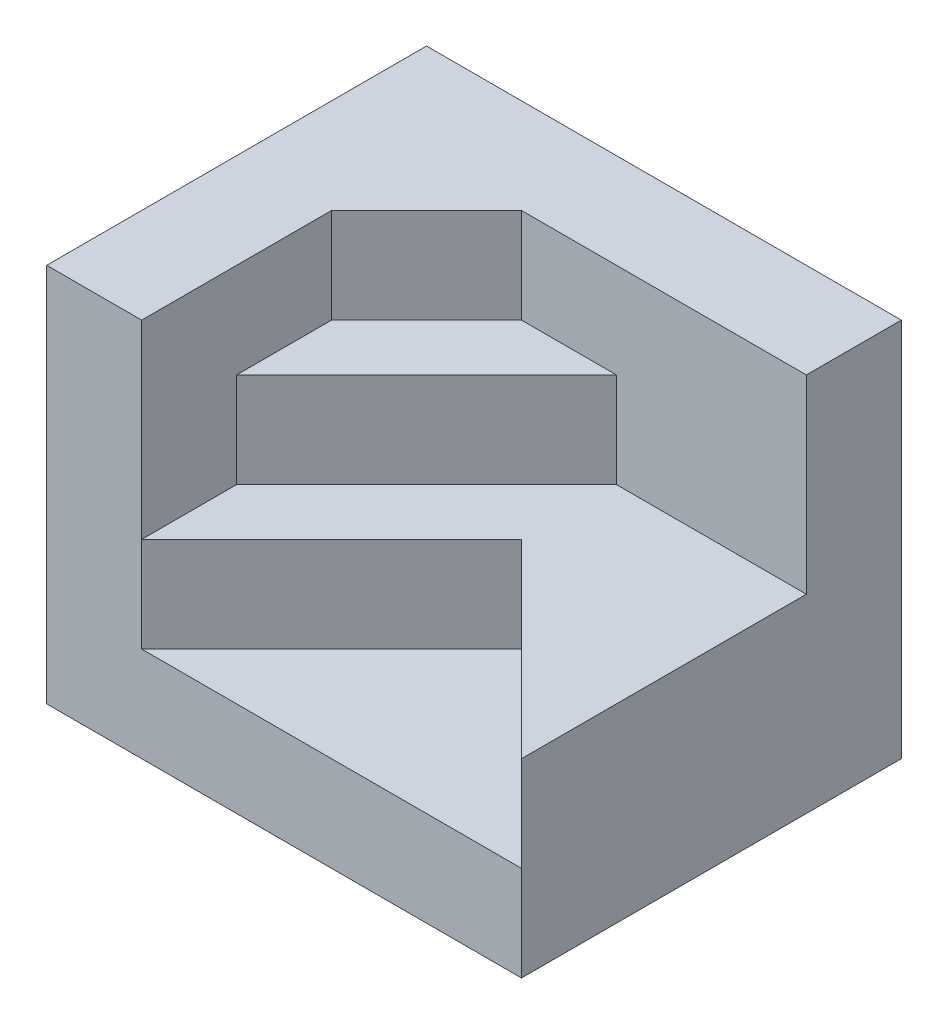
ISO-10303-21;
HEADER;
FILE_DESCRIPTION(('STEP AP214'),'2;1');
FILE_NAME('part.step','',(''),(''),'','','');
FILE_SCHEMA(('AUTOMOTIVE_DESIGN { 1 0 10303 214 1 1 1 1 }'));
ENDSEC;
DATA;
#1=APPLICATION_CONTEXT('core data for automotive mechanical design processes');
#2=APPLICATION_PROTOCOL_DEFINITION('international standard','automotive_design',2000,#1);
#3=PRODUCT_CONTEXT('',#1,'mechanical');
#4=PRODUCT('Part','Part','',(#3));
#5=PRODUCT_RELATED_PRODUCT_CATEGORY('part','',(#4));
#6=PRODUCT_DEFINITION_FORMATION('','',#4);
#7=PRODUCT_DEFINITION_CONTEXT('part definition',#1,'design');
#8=PRODUCT_DEFINITION('design','',#6,#7);
#9=PRODUCT_DEFINITION_SHAPE('','',#8);
#10=(LENGTH_UNIT() NAMED_UNIT(*) SI_UNIT(.MILLI.,.METRE.));
#11=(NAMED_UNIT(*) PLANE_ANGLE_UNIT() SI_UNIT($,.RADIAN.));
#12=(NAMED_UNIT(*) SI_UNIT($,.STERADIAN.) SOLID_ANGLE_UNIT());
#13=UNCERTAINTY_MEASURE_WITH_UNIT(LENGTH_MEASURE(1.E-05),#10,'distance_accuracy_value','');
#14=(GEOMETRIC_REPRESENTATION_CONTEXT(3) GLOBAL_UNCERTAINTY_ASSIGNED_CONTEXT((#13)) GLOBAL_UNIT_ASSIGNED_CONTEXT((#10,
#11,#12)) REPRESENTATION_CONTEXT('',''));
#15=CARTESIAN_POINT('',(0.,0.,0.));
#16=DIRECTION('',(0.,0.,1.));
#17=DIRECTION('',(1.,0.,0.));
#18=AXIS2_PLACEMENT_3D('',#15,#16,#17);
#19=CARTESIAN_POINT('',(1.,4.,0.));
#20=DIRECTION('',(-1.,0.,0.));
#21=DIRECTION('',(0.,0.,1.));
#22=AXIS2_PLACEMENT_3D('',#19,#20,#21);
#23=PLANE('',#22);
#24=DIRECTION('',(0.,-1.,0.));
#25=VECTOR('',#24,1.);
#26=CARTESIAN_POINT('',(1.,3.,-0.999999999999998));
#27=LINE('',#26,#25);
#28=CARTESIAN_POINT('',(1.,3.,-0.999999999999998));
#29=VERTEX_POINT('',#28);
#30=CARTESIAN_POINT('',(1.,2.,-0.999999999999999));
#31=VERTEX_POINT('',#30);
#32=EDGE_CURVE('E50',#29,#31,#27,.T.);
#33=ORIENTED_EDGE('',*,*,#32,.F.);
#34=DIRECTION('',(0.,0.,1.));
#35=VECTOR('',#34,1.);
#36=CARTESIAN_POINT('',(1.,3.,-0.999999999999998));
#37=LINE('',#36,#35);
#38=CARTESIAN_POINT('',(1.,3.,-2.));
#39=VERTEX_POINT('',#38);
#40=EDGE_CURVE('E131',#39,#29,#37,.T.);
#41=ORIENTED_EDGE('',*,*,#40,.F.);
#42=DIRECTION('',(0.,-1.,0.));
#43=VECTOR('',#42,1.);
#44=CARTESIAN_POINT('',(1.,4.,-2.));
#45=LINE('',#44,#43);
#46=CARTESIAN_POINT('',(1.,4.,-2.));
#47=VERTEX_POINT('',#46);
#48=EDGE_CURVE('E192',#47,#39,#45,.T.);
#49=ORIENTED_EDGE('',*,*,#48,.F.);
#50=DIRECTION('',(0.,0.,-1.));
#51=VECTOR('',#50,1.);
#52=CARTESIAN_POINT('',(1.,4.,0.));
#53=LINE('',#52,#51);
#54=CARTESIAN_POINT('',(1.,4.,0.));
#55=VERTEX_POINT('',#54);
#56=EDGE_CURVE('E174',#55,#47,#53,.T.);
#57=ORIENTED_EDGE('',*,*,#56,.F.);
#58=DIRECTION('',(0.,-1.,0.));
#59=VECTOR('',#58,1.);
#60=CARTESIAN_POINT('',(1.,4.,0.));
#61=LINE('',#60,#59);
#62=CARTESIAN_POINT('',(1.,2.,0.));
#63=VERTEX_POINT('',#62);
#64=EDGE_CURVE('E194',#55,#63,#61,.T.);
#65=ORIENTED_EDGE('',*,*,#64,.T.);
#66=DIRECTION('',(0.,0.,1.));
#67=VECTOR('',#66,1.);
#68=CARTESIAN_POINT('',(1.,2.,0.));
#69=LINE('',#68,#67);
#70=EDGE_CURVE('E144',#31,#63,#69,.T.);
#71=ORIENTED_EDGE('',*,*,#70,.F.);
#72=EDGE_LOOP('',(#33,#41,#49,#57,#65,#71));
#73=FACE_BOUND('',#72,.T.);
#74=ADVANCED_FACE('F35',(#73),#23,.F.);
#75=CARTESIAN_POINT('',(1.,4.,-2.));
#76=DIRECTION('',(-0.707106781186548,0.,-0.707106781186547));
#77=DIRECTION('',(-0.707106781186547,0.,0.707106781186548));
#78=AXIS2_PLACEMENT_3D('',#75,#76,#77);
#79=PLANE('',#78);
#80=DIRECTION('',(-0.707106781186547,0.,0.707106781186548));
#81=VECTOR('',#80,1.);
#82=CARTESIAN_POINT('',(1.,3.,-2.));
#83=LINE('',#82,#81);
#84=CARTESIAN_POINT('',(2.,3.,-3.));
#85=VERTEX_POINT('',#84);
#86=EDGE_CURVE('E136',#85,#39,#83,.T.);
#87=ORIENTED_EDGE('',*,*,#86,.F.);
#88=DIRECTION('',(0.,-1.,0.));
#89=VECTOR('',#88,1.);
#90=CARTESIAN_POINT('',(2.,4.,-3.));
#91=LINE('',#90,#89);
#92=CARTESIAN_POINT('',(2.,4.,-3.));
#93=VERTEX_POINT('',#92);
#94=EDGE_CURVE('E189',#93,#85,#91,.T.);
#95=ORIENTED_EDGE('',*,*,#94,.F.);
#96=DIRECTION('',(0.707106781186547,0.,-0.707106781186548));
#97=VECTOR('',#96,1.);
#98=CARTESIAN_POINT('',(1.,4.,-2.));
#99=LINE('',#98,#97);
#100=EDGE_CURVE('E176',#47,#93,#99,.T.);
#101=ORIENTED_EDGE('',*,*,#100,.F.);
#102=ORIENTED_EDGE('',*,*,#48,.T.);
#103=EDGE_LOOP('',(#87,#95,#101,#102));
#104=FACE_BOUND('',#103,.T.);
#105=ADVANCED_FACE('F246',(#104),#79,.F.);
#106=CARTESIAN_POINT('',(2.,4.,-3.));
#107=DIRECTION('',(0.,0.,-1.));
#108=DIRECTION('',(-1.,0.,0.));
#109=AXIS2_PLACEMENT_3D('',#106,#107,#108);
#110=PLANE('',#109);
#111=DIRECTION('',(0.,-1.,0.));
#112=VECTOR('',#111,1.);
#113=CARTESIAN_POINT('',(3.,3.,-3.));
#114=LINE('',#113,#112);
#115=CARTESIAN_POINT('',(3.,3.,-3.));
#116=VERTEX_POINT('',#115);
#117=CARTESIAN_POINT('',(3.,2.,-3.));
#118=VERTEX_POINT('',#117);
#119=EDGE_CURVE('E127',#116,#118,#114,.T.);
#120=ORIENTED_EDGE('',*,*,#119,.T.);
#121=DIRECTION('',(-1.,0.,0.));
#122=VECTOR('',#121,1.);
#123=CARTESIAN_POINT('',(2.,2.,-3.));
#124=LINE('',#123,#122);
#125=CARTESIAN_POINT('',(5.,2.,-3.));
#126=VERTEX_POINT('',#125);
#127=EDGE_CURVE('E153',#126,#118,#124,.T.);
#128=ORIENTED_EDGE('',*,*,#127,.F.);
#129=DIRECTION('',(0.,-1.,0.));
#130=VECTOR('',#129,1.);
#131=CARTESIAN_POINT('',(5.,4.,-3.));
#132=LINE('',#131,#130);
#133=CARTESIAN_POINT('',(5.,4.,-3.));
#134=VERTEX_POINT('',#133);
#135=EDGE_CURVE('E186',#134,#126,#132,.T.);
#136=ORIENTED_EDGE('',*,*,#135,.F.);
#137=DIRECTION('',(1.,0.,0.));
#138=VECTOR('',#137,1.);
#139=CARTESIAN_POINT('',(2.,4.,-3.));
#140=LINE('',#139,#138);
#141=EDGE_CURVE('E178',#93,#134,#140,.T.);
#142=ORIENTED_EDGE('',*,*,#141,.F.);
#143=ORIENTED_EDGE('',*,*,#94,.T.);
#144=DIRECTION('',(-1.,0.,0.));
#145=VECTOR('',#144,1.);
#146=CARTESIAN_POINT('',(2.,3.,-3.));
#147=LINE('',#146,#145);
#148=EDGE_CURVE('E130',#116,#85,#147,.T.);
#149=ORIENTED_EDGE('',*,*,#148,.F.);
#150=EDGE_LOOP('',(#120,#128,#136,#142,#143,#149));
#151=FACE_BOUND('',#150,.T.);
#152=ADVANCED_FACE('F239',(#151),#110,.F.);
#153=CARTESIAN_POINT('',(0.,2.,0.));
#154=DIRECTION('',(0.,1.,0.));
#155=DIRECTION('',(0.,0.,1.));
#156=AXIS2_PLACEMENT_3D('',#153,#154,#155);
#157=PLANE('',#156);
#158=ORIENTED_EDGE('',*,*,#127,.T.);
#159=DIRECTION('',(0.707106781186547,0.,-0.707106781186548));
#160=VECTOR('',#159,1.);
#161=CARTESIAN_POINT('',(3.,2.,-3.));
#162=LINE('',#161,#160);
#163=EDGE_CURVE('E140',#31,#118,#162,.T.);
#164=ORIENTED_EDGE('',*,*,#163,.F.);
#165=ORIENTED_EDGE('',*,*,#70,.T.);
#166=DIRECTION('',(0.707106781186548,0.,-0.707106781186548));
#167=VECTOR('',#166,1.);
#168=CARTESIAN_POINT('',(3.,2.,-2.));
#169=LINE('',#168,#167);
#170=CARTESIAN_POINT('',(3.,2.,-2.));
#171=VERTEX_POINT('',#170);
#172=EDGE_CURVE('E156',#63,#171,#169,.T.);
#173=ORIENTED_EDGE('',*,*,#172,.T.);
#174=DIRECTION('',(0.707106781186548,0.,0.707106781186548));
#175=VECTOR('',#174,1.);
#176=CARTESIAN_POINT('',(5.,2.,0.));
#177=LINE('',#176,#175);
#178=CARTESIAN_POINT('',(5.,2.,0.));
#179=VERTEX_POINT('',#178);
#180=EDGE_CURVE('E158',#171,#179,#177,.T.);
#181=ORIENTED_EDGE('',*,*,#180,.T.);
#182=DIRECTION('',(0.,0.,-1.));
#183=VECTOR('',#182,1.);
#184=CARTESIAN_POINT('',(5.,2.,-3.));
#185=LINE('',#184,#183);
#186=EDGE_CURVE('E58',#179,#126,#185,.T.);
#187=ORIENTED_EDGE('',*,*,#186,.T.);
#188=EDGE_LOOP('',(#158,#164,#165,#173,#181,#187));
#189=FACE_BOUND('',#188,.T.);
#190=ADVANCED_FACE('F240',(#189),#157,.T.);
#191=CARTESIAN_POINT('',(0.,1.,0.));
#192=DIRECTION('',(0.,-1.,0.));
#193=DIRECTION('',(0.,0.,-1.));
#194=AXIS2_PLACEMENT_3D('',#191,#192,#193);
#195=PLANE('',#194);
#196=DIRECTION('',(0.707106781186548,0.,-0.707106781186548));
#197=VECTOR('',#196,1.);
#198=CARTESIAN_POINT('',(3.,1.,-2.));
#199=LINE('',#198,#197);
#200=CARTESIAN_POINT('',(1.,1.,0.));
#201=VERTEX_POINT('',#200);
#202=CARTESIAN_POINT('',(3.,1.,-2.));
#203=VERTEX_POINT('',#202);
#204=EDGE_CURVE('E145',#201,#203,#199,.T.);
#205=ORIENTED_EDGE('',*,*,#204,.F.);
#206=DIRECTION('',(1.,0.,0.));
#207=VECTOR('',#206,1.);
#208=CARTESIAN_POINT('',(5.,1.,0.));
#209=LINE('',#208,#207);
#210=CARTESIAN_POINT('',(5.,1.,0.));
#211=VERTEX_POINT('',#210);
#212=EDGE_CURVE('E197',#201,#211,#209,.T.);
#213=ORIENTED_EDGE('',*,*,#212,.T.);
#214=DIRECTION('',(0.707106781186548,0.,0.707106781186548));
#215=VECTOR('',#214,1.);
#216=CARTESIAN_POINT('',(5.,1.,0.));
#217=LINE('',#216,#215);
#218=EDGE_CURVE('E147',#203,#211,#217,.T.);
#219=ORIENTED_EDGE('',*,*,#218,.F.);
#220=EDGE_LOOP('',(#205,#213,#219));
#221=FACE_BOUND('',#220,.T.);
#222=ADVANCED_FACE('F258',(#221),#195,.F.);
#223=CARTESIAN_POINT('',(5.,1.,0.));
#224=DIRECTION('',(0.,0.,-1.));
#225=DIRECTION('',(-1.,0.,0.));
#226=AXIS2_PLACEMENT_3D('',#223,#224,#225);
#227=PLANE('',#226);
#228=DIRECTION('',(1.,0.,0.));
#229=VECTOR('',#228,1.);
#230=CARTESIAN_POINT('',(5.,0.,0.));
#231=LINE('',#230,#229);
#232=CARTESIAN_POINT('',(0.,0.,0.));
#233=VERTEX_POINT('',#232);
#234=CARTESIAN_POINT('',(5.,0.,0.));
#235=VERTEX_POINT('',#234);
#236=EDGE_CURVE('E196',#233,#235,#231,.T.);
#237=ORIENTED_EDGE('',*,*,#236,.T.);
#238=DIRECTION('',(0.,-1.,0.));
#239=VECTOR('',#238,1.);
#240=CARTESIAN_POINT('',(5.,1.,0.));
#241=LINE('',#240,#239);
#242=EDGE_CURVE('E11',#211,#235,#241,.T.);
#243=ORIENTED_EDGE('',*,*,#242,.F.);
#244=ORIENTED_EDGE('',*,*,#212,.F.);
#245=DIRECTION('',(0.,-1.,0.));
#246=VECTOR('',#245,1.);
#247=CARTESIAN_POINT('',(1.,2.,0.));
#248=LINE('',#247,#246);
#249=EDGE_CURVE('E167',#63,#201,#248,.T.);
#250=ORIENTED_EDGE('',*,*,#249,.F.);
#251=ORIENTED_EDGE('',*,*,#64,.F.);
#252=DIRECTION('',(1.,0.,0.));
#253=VECTOR('',#252,1.);
#254=CARTESIAN_POINT('',(0.,4.,0.));
#255=LINE('',#254,#253);
#256=CARTESIAN_POINT('',(0.,4.,0.));
#257=VERTEX_POINT('',#256);
#258=EDGE_CURVE('E172',#257,#55,#255,.T.);
#259=ORIENTED_EDGE('',*,*,#258,.F.);
#260=DIRECTION('',(0.,-1.,0.));
#261=VECTOR('',#260,1.);
#262=CARTESIAN_POINT('',(0.,1.,0.));
#263=LINE('',#262,#261);
#264=EDGE_CURVE('E200',#257,#233,#263,.T.);
#265=ORIENTED_EDGE('',*,*,#264,.T.);
#266=EDGE_LOOP('',(#237,#243,#244,#250,#251,#259,#265));
#267=FACE_BOUND('',#266,.T.);
#268=ADVANCED_FACE('F37',(#267),#227,.F.);
#269=CARTESIAN_POINT('',(5.,1.,-4.));
#270=DIRECTION('',(-1.,0.,0.));
#271=DIRECTION('',(0.,0.,1.));
#272=AXIS2_PLACEMENT_3D('',#269,#270,#271);
#273=PLANE('',#272);
#274=DIRECTION('',(0.,0.,-1.));
#275=VECTOR('',#274,1.);
#276=CARTESIAN_POINT('',(5.,0.,-4.));
#277=LINE('',#276,#275);
#278=CARTESIAN_POINT('',(5.,0.,-4.));
#279=VERTEX_POINT('',#278);
#280=EDGE_CURVE('E204',#235,#279,#277,.T.);
#281=ORIENTED_EDGE('',*,*,#280,.T.);
#282=DIRECTION('',(0.,-1.,0.));
#283=VECTOR('',#282,1.);
#284=CARTESIAN_POINT('',(5.,1.,-4.));
#285=LINE('',#284,#283);
#286=CARTESIAN_POINT('',(5.,4.,-4.));
#287=VERTEX_POINT('',#286);
#288=EDGE_CURVE('E43',#287,#279,#285,.T.);
#289=ORIENTED_EDGE('',*,*,#288,.F.);
#290=DIRECTION('',(0.,0.,-1.));
#291=VECTOR('',#290,1.);
#292=CARTESIAN_POINT('',(5.,4.,-3.));
#293=LINE('',#292,#291);
#294=EDGE_CURVE('E180',#134,#287,#293,.T.);
#295=ORIENTED_EDGE('',*,*,#294,.F.);
#296=ORIENTED_EDGE('',*,*,#135,.T.);
#297=ORIENTED_EDGE('',*,*,#186,.F.);
#298=DIRECTION('',(0.,-1.,0.));
#299=VECTOR('',#298,1.);
#300=CARTESIAN_POINT('',(5.,2.,0.));
#301=LINE('',#300,#299);
#302=EDGE_CURVE('E159',#179,#211,#301,.T.);
#303=ORIENTED_EDGE('',*,*,#302,.T.);
#304=ORIENTED_EDGE('',*,*,#242,.T.);
#305=EDGE_LOOP('',(#281,#289,#295,#296,#297,#303,#304));
#306=FACE_BOUND('',#305,.T.);
#307=ADVANCED_FACE('F237',(#306),#273,.F.);
#308=CARTESIAN_POINT('',(0.,1.,-4.));
#309=DIRECTION('',(0.,0.,1.));
#310=DIRECTION('',(1.,0.,0.));
#311=AXIS2_PLACEMENT_3D('',#308,#309,#310);
#312=PLANE('',#311);
#313=DIRECTION('',(-1.,0.,0.));
#314=VECTOR('',#313,1.);
#315=CARTESIAN_POINT('',(0.,0.,-4.));
#316=LINE('',#315,#314);
#317=CARTESIAN_POINT('',(0.,0.,-4.));
#318=VERTEX_POINT('',#317);
#319=EDGE_CURVE('E206',#279,#318,#316,.T.);
#320=ORIENTED_EDGE('',*,*,#319,.T.);
#321=DIRECTION('',(0.,-1.,0.));
#322=VECTOR('',#321,1.);
#323=CARTESIAN_POINT('',(0.,1.,-4.));
#324=LINE('',#323,#322);
#325=CARTESIAN_POINT('',(0.,4.,-4.));
#326=VERTEX_POINT('',#325);
#327=EDGE_CURVE('E211',#326,#318,#324,.T.);
#328=ORIENTED_EDGE('',*,*,#327,.F.);
#329=DIRECTION('',(-1.,0.,0.));
#330=VECTOR('',#329,1.);
#331=CARTESIAN_POINT('',(5.,4.,-4.));
#332=LINE('',#331,#330);
#333=EDGE_CURVE('E183',#287,#326,#332,.T.);
#334=ORIENTED_EDGE('',*,*,#333,.F.);
#335=ORIENTED_EDGE('',*,*,#288,.T.);
#336=EDGE_LOOP('',(#320,#328,#334,#335));
#337=FACE_BOUND('',#336,.T.);
#338=ADVANCED_FACE('F217',(#337),#312,.F.);
#339=CARTESIAN_POINT('',(0.,1.,0.));
#340=DIRECTION('',(1.,0.,0.));
#341=DIRECTION('',(0.,0.,-1.));
#342=AXIS2_PLACEMENT_3D('',#339,#340,#341);
#343=PLANE('',#342);
#344=DIRECTION('',(0.,0.,1.));
#345=VECTOR('',#344,1.);
#346=CARTESIAN_POINT('',(0.,0.,0.));
#347=LINE('',#346,#345);
#348=EDGE_CURVE('E201',#318,#233,#347,.T.);
#349=ORIENTED_EDGE('',*,*,#348,.T.);
#350=ORIENTED_EDGE('',*,*,#264,.F.);
#351=DIRECTION('',(0.,0.,1.));
#352=VECTOR('',#351,1.);
#353=CARTESIAN_POINT('',(0.,4.,-4.));
#354=LINE('',#353,#352);
#355=EDGE_CURVE('E169',#326,#257,#354,.T.);
#356=ORIENTED_EDGE('',*,*,#355,.F.);
#357=ORIENTED_EDGE('',*,*,#327,.T.);
#358=EDGE_LOOP('',(#349,#350,#356,#357));
#359=FACE_BOUND('',#358,.T.);
#360=ADVANCED_FACE('F225',(#359),#343,.F.);
#361=CARTESIAN_POINT('',(0.,0.,0.));
#362=DIRECTION('',(0.,-1.,0.));
#363=DIRECTION('',(0.,0.,-1.));
#364=AXIS2_PLACEMENT_3D('',#361,#362,#363);
#365=PLANE('',#364);
#366=ORIENTED_EDGE('',*,*,#236,.F.);
#367=ORIENTED_EDGE('',*,*,#348,.F.);
#368=ORIENTED_EDGE('',*,*,#319,.F.);
#369=ORIENTED_EDGE('',*,*,#280,.F.);
#370=EDGE_LOOP('',(#366,#367,#368,#369));
#371=FACE_BOUND('',#370,.T.);
#372=ADVANCED_FACE('F223',(#371),#365,.T.);
#373=CARTESIAN_POINT('',(0.,4.,0.));
#374=DIRECTION('',(0.,1.,0.));
#375=DIRECTION('',(0.,0.,1.));
#376=AXIS2_PLACEMENT_3D('',#373,#374,#375);
#377=PLANE('',#376);
#378=ORIENTED_EDGE('',*,*,#355,.T.);
#379=ORIENTED_EDGE('',*,*,#258,.T.);
#380=ORIENTED_EDGE('',*,*,#56,.T.);
#381=ORIENTED_EDGE('',*,*,#100,.T.);
#382=ORIENTED_EDGE('',*,*,#141,.T.);
#383=ORIENTED_EDGE('',*,*,#294,.T.);
#384=ORIENTED_EDGE('',*,*,#333,.T.);
#385=EDGE_LOOP('',(#378,#379,#380,#381,#382,#383,#384));
#386=FACE_BOUND('',#385,.T.);
#387=ADVANCED_FACE('F234',(#386),#377,.T.);
#388=CARTESIAN_POINT('',(3.,2.,-2.));
#389=DIRECTION('',(-0.707106781186548,0.,-0.707106781186547));
#390=DIRECTION('',(-0.707106781186547,0.,0.707106781186548));
#391=AXIS2_PLACEMENT_3D('',#388,#389,#390);
#392=PLANE('',#391);
#393=ORIENTED_EDGE('',*,*,#204,.T.);
#394=DIRECTION('',(0.,-1.,0.));
#395=VECTOR('',#394,1.);
#396=CARTESIAN_POINT('',(3.,2.,-2.));
#397=LINE('',#396,#395);
#398=EDGE_CURVE('E164',#171,#203,#397,.T.);
#399=ORIENTED_EDGE('',*,*,#398,.F.);
#400=ORIENTED_EDGE('',*,*,#172,.F.);
#401=ORIENTED_EDGE('',*,*,#249,.T.);
#402=EDGE_LOOP('',(#393,#399,#400,#401));
#403=FACE_BOUND('',#402,.T.);
#404=ADVANCED_FACE('F310',(#403),#392,.F.);
#405=CARTESIAN_POINT('',(5.,2.,0.));
#406=DIRECTION('',(0.707106781186548,0.,-0.707106781186547));
#407=DIRECTION('',(-0.707106781186547,0.,-0.707106781186548));
#408=AXIS2_PLACEMENT_3D('',#405,#406,#407);
#409=PLANE('',#408);
#410=ORIENTED_EDGE('',*,*,#218,.T.);
#411=ORIENTED_EDGE('',*,*,#302,.F.);
#412=ORIENTED_EDGE('',*,*,#180,.F.);
#413=ORIENTED_EDGE('',*,*,#398,.T.);
#414=EDGE_LOOP('',(#410,#411,#412,#413));
#415=FACE_BOUND('',#414,.T.);
#416=ADVANCED_FACE('F305',(#415),#409,.F.);
#417=CARTESIAN_POINT('',(3.,3.,-3.));
#418=DIRECTION('',(-0.707106781186548,0.,-0.707106781186547));
#419=DIRECTION('',(-0.707106781186547,0.,0.707106781186548));
#420=AXIS2_PLACEMENT_3D('',#417,#418,#419);
#421=PLANE('',#420);
#422=ORIENTED_EDGE('',*,*,#163,.T.);
#423=ORIENTED_EDGE('',*,*,#119,.F.);
#424=DIRECTION('',(0.707106781186547,0.,-0.707106781186548));
#425=VECTOR('',#424,1.);
#426=CARTESIAN_POINT('',(3.,3.,-3.));
#427=LINE('',#426,#425);
#428=EDGE_CURVE('E123',#29,#116,#427,.T.);
#429=ORIENTED_EDGE('',*,*,#428,.F.);
#430=ORIENTED_EDGE('',*,*,#32,.T.);
#431=EDGE_LOOP('',(#422,#423,#429,#430));
#432=FACE_BOUND('',#431,.T.);
#433=ADVANCED_FACE('F125',(#432),#421,.F.);
#434=CARTESIAN_POINT('',(0.,3.,0.));
#435=DIRECTION('',(0.,-1.,0.));
#436=DIRECTION('',(0.,0.,-1.));
#437=AXIS2_PLACEMENT_3D('',#434,#435,#436);
#438=PLANE('',#437);
#439=ORIENTED_EDGE('',*,*,#40,.T.);
#440=ORIENTED_EDGE('',*,*,#428,.T.);
#441=ORIENTED_EDGE('',*,*,#148,.T.);
#442=ORIENTED_EDGE('',*,*,#86,.T.);
#443=EDGE_LOOP('',(#439,#440,#441,#442));
#444=FACE_BOUND('',#443,.T.);
#445=ADVANCED_FACE('F134',(#444),#438,.F.);
#446=CLOSED_SHELL('',(#74,#105,#152,#190,#222,#268,#307,#338,#360,#372,#387,#404,#416,#433,#445));
#447=MANIFOLD_SOLID_BREP('B2',#446);
#448=ADVANCED_BREP_SHAPE_REPRESENTATION('',(#18,#447),#14);
#449=SHAPE_DEFINITION_REPRESENTATION(#9,#448);
ENDSEC;
END-ISO-10303-21;
